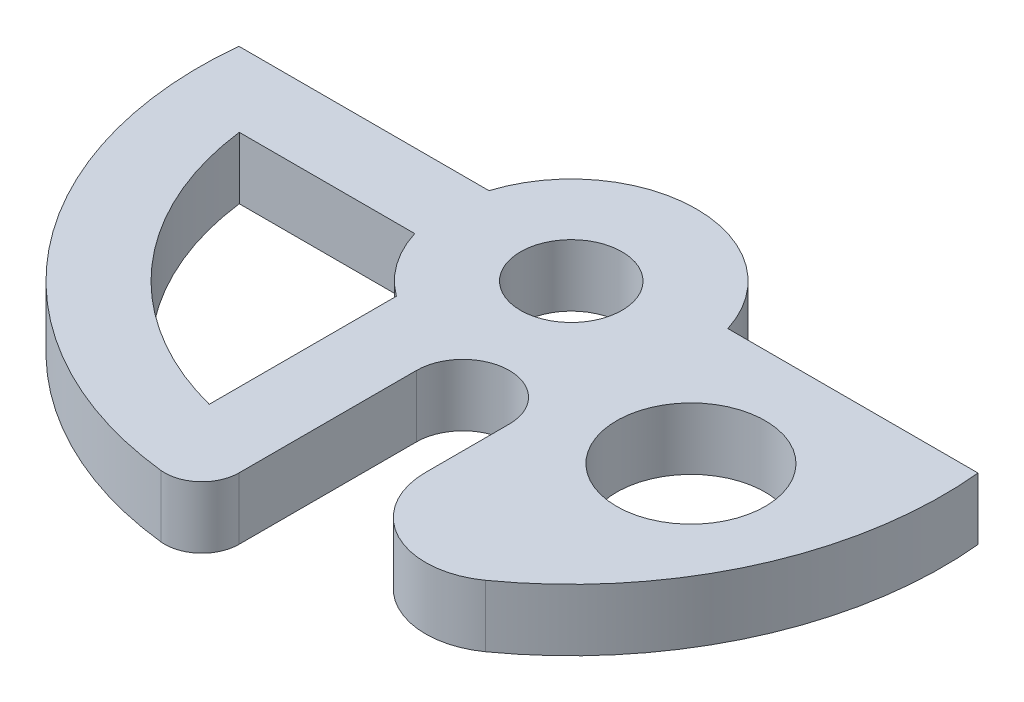
ISO-10303-21;
HEADER;
FILE_DESCRIPTION(('STEP AP214'),'2;1');
FILE_NAME('part.step','',(''),(''),'','','');
FILE_SCHEMA(('AUTOMOTIVE_DESIGN { 1 0 10303 214 1 1 1 1 }'));
ENDSEC;
DATA;
#1=APPLICATION_CONTEXT('core data for automotive mechanical design processes');
#2=APPLICATION_PROTOCOL_DEFINITION('international standard','automotive_design',2000,#1);
#3=PRODUCT_CONTEXT('',#1,'mechanical');
#4=PRODUCT('Part','Part','',(#3));
#5=PRODUCT_RELATED_PRODUCT_CATEGORY('part','',(#4));
#6=PRODUCT_DEFINITION_FORMATION('','',#4);
#7=PRODUCT_DEFINITION_CONTEXT('part definition',#1,'design');
#8=PRODUCT_DEFINITION('design','',#6,#7);
#9=PRODUCT_DEFINITION_SHAPE('','',#8);
#10=(LENGTH_UNIT() NAMED_UNIT(*) SI_UNIT(.MILLI.,.METRE.));
#11=(NAMED_UNIT(*) PLANE_ANGLE_UNIT() SI_UNIT($,.RADIAN.));
#12=(NAMED_UNIT(*) SI_UNIT($,.STERADIAN.) SOLID_ANGLE_UNIT());
#13=UNCERTAINTY_MEASURE_WITH_UNIT(LENGTH_MEASURE(1.E-05),#10,'distance_accuracy_value','');
#14=(GEOMETRIC_REPRESENTATION_CONTEXT(3) GLOBAL_UNCERTAINTY_ASSIGNED_CONTEXT((#13)) GLOBAL_UNIT_ASSIGNED_CONTEXT((#10,
#11,#12)) REPRESENTATION_CONTEXT('',''));
#15=CARTESIAN_POINT('',(0.,0.,0.));
#16=DIRECTION('',(0.,0.,1.));
#17=DIRECTION('',(1.,0.,0.));
#18=AXIS2_PLACEMENT_3D('',#15,#16,#17);
#19=CARTESIAN_POINT('',(0.,5.,0.));
#20=DIRECTION('',(0.,1.,0.));
#21=DIRECTION('',(0.,0.,1.));
#22=AXIS2_PLACEMENT_3D('',#19,#20,#21);
#23=PLANE('',#22);
#24=CARTESIAN_POINT('',(17.5966726849026,5.,7.92934309127702));
#25=DIRECTION('',(0.,1.,0.));
#26=DIRECTION('',(0.,0.,1.));
#27=AXIS2_PLACEMENT_3D('',#24,#25,#26);
#28=CIRCLE('',#27,6.);
#29=CARTESIAN_POINT('',(17.5966726849026,5.,13.929343091277));
#30=VERTEX_POINT('',#29);
#31=EDGE_CURVE('E158',#30,#30,#28,.T.);
#32=ORIENTED_EDGE('',*,*,#31,.F.);
#33=EDGE_LOOP('',(#32));
#34=FACE_BOUND('',#33,.T.);
#35=CARTESIAN_POINT('',(0.,5.,0.));
#36=DIRECTION('',(0.,1.,0.));
#37=DIRECTION('',(0.,0.,1.));
#38=AXIS2_PLACEMENT_3D('',#35,#36,#37);
#39=CIRCLE('',#38,4.1);
#40=CARTESIAN_POINT('',(0.,5.,4.1));
#41=VERTEX_POINT('',#40);
#42=EDGE_CURVE('E199',#41,#41,#39,.T.);
#43=ORIENTED_EDGE('',*,*,#42,.F.);
#44=EDGE_LOOP('',(#43));
#45=FACE_BOUND('',#44,.T.);
#46=CARTESIAN_POINT('',(0.,5.,0.));
#47=DIRECTION('',(0.,1.,0.));
#48=DIRECTION('',(0.,0.,1.));
#49=AXIS2_PLACEMENT_3D('',#46,#47,#48);
#50=CIRCLE('',#49,10.1);
#51=CARTESIAN_POINT('',(9.64416922290355,5.,-3.));
#52=VERTEX_POINT('',#51);
#53=CARTESIAN_POINT('',(-9.64416922290355,5.,-3.));
#54=VERTEX_POINT('',#53);
#55=EDGE_CURVE('E186',#52,#54,#50,.T.);
#56=ORIENTED_EDGE('',*,*,#55,.T.);
#57=DIRECTION('',(-1.,0.,0.));
#58=VECTOR('',#57,1.);
#59=CARTESIAN_POINT('',(0.,5.,-3.));
#60=LINE('',#59,#58);
#61=CARTESIAN_POINT('',(-29.8496231131986,5.,-3.));
#62=VERTEX_POINT('',#61);
#63=EDGE_CURVE('E171',#54,#62,#60,.T.);
#64=ORIENTED_EDGE('',*,*,#63,.T.);
#65=CARTESIAN_POINT('',(0.,5.,0.));
#66=DIRECTION('',(0.,1.,0.));
#67=DIRECTION('',(0.,0.,1.));
#68=AXIS2_PLACEMENT_3D('',#65,#66,#67);
#69=CIRCLE('',#68,30.);
#70=CARTESIAN_POINT('',(-3.33333333333333,5.,29.8142396999972));
#71=VERTEX_POINT('',#70);
#72=EDGE_CURVE('E212',#62,#71,#69,.T.);
#73=ORIENTED_EDGE('',*,*,#72,.T.);
#74=CARTESIAN_POINT('',(-3.,5.,26.8328157299975));
#75=DIRECTION('',(0.,1.,0.));
#76=DIRECTION('',(0.,0.,1.));
#77=AXIS2_PLACEMENT_3D('',#74,#75,#76);
#78=CIRCLE('',#77,3.);
#79=CARTESIAN_POINT('',(0.,5.,26.8328157299975));
#80=VERTEX_POINT('',#79);
#81=EDGE_CURVE('E11',#71,#80,#78,.T.);
#82=ORIENTED_EDGE('',*,*,#81,.T.);
#83=DIRECTION('',(0.,0.,1.));
#84=VECTOR('',#83,1.);
#85=CARTESIAN_POINT('',(0.,5.,0.));
#86=LINE('',#85,#84);
#87=CARTESIAN_POINT('',(0.,5.,12.5));
#88=VERTEX_POINT('',#87);
#89=EDGE_CURVE('E216',#88,#80,#86,.T.);
#90=ORIENTED_EDGE('',*,*,#89,.F.);
#91=CARTESIAN_POINT('',(3.75,5.,12.5));
#92=DIRECTION('',(0.,1.,0.));
#93=DIRECTION('',(0.,0.,1.));
#94=AXIS2_PLACEMENT_3D('',#91,#92,#93);
#95=CIRCLE('',#94,3.75);
#96=CARTESIAN_POINT('',(7.5,5.,12.5));
#97=VERTEX_POINT('',#96);
#98=EDGE_CURVE('E202',#97,#88,#95,.T.);
#99=ORIENTED_EDGE('',*,*,#98,.F.);
#100=DIRECTION('',(0.,0.,1.));
#101=VECTOR('',#100,1.);
#102=CARTESIAN_POINT('',(7.5,5.,0.));
#103=LINE('',#102,#101);
#104=CARTESIAN_POINT('',(7.5,5.,19.2678488679977));
#105=VERTEX_POINT('',#104);
#106=EDGE_CURVE('E206',#97,#105,#103,.T.);
#107=ORIENTED_EDGE('',*,*,#106,.T.);
#108=CARTESIAN_POINT('',(13.8,5.,19.2678488679977));
#109=DIRECTION('',(0.,1.,0.));
#110=DIRECTION('',(0.,0.,1.));
#111=AXIS2_PLACEMENT_3D('',#108,#109,#110);
#112=CIRCLE('',#111,6.3);
#113=CARTESIAN_POINT('',(17.4683544303797,5.,24.3896821113895));
#114=VERTEX_POINT('',#113);
#115=EDGE_CURVE('E209',#105,#114,#112,.T.);
#116=ORIENTED_EDGE('',*,*,#115,.T.);
#117=CARTESIAN_POINT('',(29.8496231131986,5.,-3.));
#118=VERTEX_POINT('',#117);
#119=EDGE_CURVE('E213',#114,#118,#69,.T.);
#120=ORIENTED_EDGE('',*,*,#119,.T.);
#121=DIRECTION('',(1.,0.,0.));
#122=VECTOR('',#121,1.);
#123=CARTESIAN_POINT('',(0.,5.,-3.));
#124=LINE('',#123,#122);
#125=EDGE_CURVE('E178',#52,#118,#124,.T.);
#126=ORIENTED_EDGE('',*,*,#125,.F.);
#127=EDGE_LOOP('',(#56,#64,#73,#82,#90,#99,#107,#116,#120,#126));
#128=FACE_BOUND('',#127,.T.);
#129=DIRECTION('',(1.,0.,0.));
#130=VECTOR('',#129,1.);
#131=CARTESIAN_POINT('',(0.,5.,3.));
#132=LINE('',#131,#130);
#133=CARTESIAN_POINT('',(-23.8117617995813,5.,3.));
#134=VERTEX_POINT('',#133);
#135=CARTESIAN_POINT('',(-9.64416922290355,5.,3.));
#136=VERTEX_POINT('',#135);
#137=EDGE_CURVE('E164',#134,#136,#132,.T.);
#138=ORIENTED_EDGE('',*,*,#137,.T.);
#139=CARTESIAN_POINT('',(0.,5.,0.));
#140=DIRECTION('',(0.,1.,0.));
#141=DIRECTION('',(0.,0.,1.));
#142=AXIS2_PLACEMENT_3D('',#139,#140,#141);
#143=CIRCLE('',#142,10.1);
#144=CARTESIAN_POINT('',(-6.,5.,8.12465383877984));
#145=VERTEX_POINT('',#144);
#146=EDGE_CURVE('E50',#136,#145,#143,.T.);
#147=ORIENTED_EDGE('',*,*,#146,.T.);
#148=DIRECTION('',(0.,0.,-1.));
#149=VECTOR('',#148,1.);
#150=CARTESIAN_POINT('',(-6.,5.,0.));
#151=LINE('',#150,#149);
#152=CARTESIAN_POINT('',(-6.,5.,23.2379000772445));
#153=VERTEX_POINT('',#152);
#154=EDGE_CURVE('E152',#153,#145,#151,.T.);
#155=ORIENTED_EDGE('',*,*,#154,.F.);
#156=CARTESIAN_POINT('',(0.,5.,0.));
#157=DIRECTION('',(0.,1.,0.));
#158=DIRECTION('',(0.,0.,1.));
#159=AXIS2_PLACEMENT_3D('',#156,#157,#158);
#160=CIRCLE('',#159,24.);
#161=EDGE_CURVE('E155',#134,#153,#160,.T.);
#162=ORIENTED_EDGE('',*,*,#161,.F.);
#163=EDGE_LOOP('',(#138,#147,#155,#162));
#164=FACE_BOUND('',#163,.T.);
#165=ADVANCED_FACE('F35',(#34,#45,#128,#164),#23,.T.);
#166=CARTESIAN_POINT('',(0.,0.,0.));
#167=DIRECTION('',(0.,1.,0.));
#168=DIRECTION('',(0.,0.,1.));
#169=AXIS2_PLACEMENT_3D('',#166,#167,#168);
#170=PLANE('',#169);
#171=CARTESIAN_POINT('',(17.5966726849026,0.,7.92934309127702));
#172=DIRECTION('',(0.,1.,0.));
#173=DIRECTION('',(0.,0.,1.));
#174=AXIS2_PLACEMENT_3D('',#171,#172,#173);
#175=CIRCLE('',#174,6.);
#176=CARTESIAN_POINT('',(17.5966726849026,0.,13.929343091277));
#177=VERTEX_POINT('',#176);
#178=EDGE_CURVE('E165',#177,#177,#175,.T.);
#179=ORIENTED_EDGE('',*,*,#178,.T.);
#180=EDGE_LOOP('',(#179));
#181=FACE_BOUND('',#180,.T.);
#182=DIRECTION('',(-1.,0.,0.));
#183=VECTOR('',#182,1.);
#184=CARTESIAN_POINT('',(0.,0.,-3.));
#185=LINE('',#184,#183);
#186=CARTESIAN_POINT('',(-9.64416922290355,0.,-3.));
#187=VERTEX_POINT('',#186);
#188=CARTESIAN_POINT('',(-29.8496231131986,0.,-3.));
#189=VERTEX_POINT('',#188);
#190=EDGE_CURVE('E175',#187,#189,#185,.T.);
#191=ORIENTED_EDGE('',*,*,#190,.F.);
#192=CARTESIAN_POINT('',(0.,0.,0.));
#193=DIRECTION('',(0.,1.,0.));
#194=DIRECTION('',(0.,0.,1.));
#195=AXIS2_PLACEMENT_3D('',#192,#193,#194);
#196=CIRCLE('',#195,10.1);
#197=CARTESIAN_POINT('',(9.64416922290355,0.,-3.));
#198=VERTEX_POINT('',#197);
#199=EDGE_CURVE('E177',#198,#187,#196,.T.);
#200=ORIENTED_EDGE('',*,*,#199,.F.);
#201=DIRECTION('',(1.,0.,0.));
#202=VECTOR('',#201,1.);
#203=CARTESIAN_POINT('',(0.,0.,-3.));
#204=LINE('',#203,#202);
#205=CARTESIAN_POINT('',(29.8496231131986,0.,-3.));
#206=VERTEX_POINT('',#205);
#207=EDGE_CURVE('E180',#198,#206,#204,.T.);
#208=ORIENTED_EDGE('',*,*,#207,.T.);
#209=CARTESIAN_POINT('',(0.,0.,0.));
#210=DIRECTION('',(0.,1.,0.));
#211=DIRECTION('',(0.,0.,1.));
#212=AXIS2_PLACEMENT_3D('',#209,#210,#211);
#213=CIRCLE('',#212,30.);
#214=CARTESIAN_POINT('',(17.4683544303797,0.,24.3896821113895));
#215=VERTEX_POINT('',#214);
#216=EDGE_CURVE('E232',#215,#206,#213,.T.);
#217=ORIENTED_EDGE('',*,*,#216,.F.);
#218=CARTESIAN_POINT('',(13.8,0.,19.2678488679977));
#219=DIRECTION('',(0.,1.,0.));
#220=DIRECTION('',(0.,0.,1.));
#221=AXIS2_PLACEMENT_3D('',#218,#219,#220);
#222=CIRCLE('',#221,6.3);
#223=CARTESIAN_POINT('',(7.5,0.,19.2678488679977));
#224=VERTEX_POINT('',#223);
#225=EDGE_CURVE('E228',#224,#215,#222,.T.);
#226=ORIENTED_EDGE('',*,*,#225,.F.);
#227=DIRECTION('',(0.,0.,1.));
#228=VECTOR('',#227,1.);
#229=CARTESIAN_POINT('',(7.5,0.,0.));
#230=LINE('',#229,#228);
#231=CARTESIAN_POINT('',(7.5,0.,12.5));
#232=VERTEX_POINT('',#231);
#233=EDGE_CURVE('E225',#232,#224,#230,.T.);
#234=ORIENTED_EDGE('',*,*,#233,.F.);
#235=CARTESIAN_POINT('',(3.75,0.,12.5));
#236=DIRECTION('',(0.,1.,0.));
#237=DIRECTION('',(0.,0.,1.));
#238=AXIS2_PLACEMENT_3D('',#235,#236,#237);
#239=CIRCLE('',#238,3.75);
#240=CARTESIAN_POINT('',(0.,0.,12.5));
#241=VERTEX_POINT('',#240);
#242=EDGE_CURVE('E222',#232,#241,#239,.T.);
#243=ORIENTED_EDGE('',*,*,#242,.T.);
#244=DIRECTION('',(0.,0.,1.));
#245=VECTOR('',#244,1.);
#246=CARTESIAN_POINT('',(0.,0.,0.));
#247=LINE('',#246,#245);
#248=CARTESIAN_POINT('',(0.,0.,26.8328157299975));
#249=VERTEX_POINT('',#248);
#250=EDGE_CURVE('E203',#241,#249,#247,.T.);
#251=ORIENTED_EDGE('',*,*,#250,.T.);
#252=CARTESIAN_POINT('',(-3.,0.,26.8328157299975));
#253=DIRECTION('',(0.,1.,0.));
#254=DIRECTION('',(0.,0.,1.));
#255=AXIS2_PLACEMENT_3D('',#252,#253,#254);
#256=CIRCLE('',#255,3.);
#257=CARTESIAN_POINT('',(-3.33333333333333,0.,29.8142396999972));
#258=VERTEX_POINT('',#257);
#259=EDGE_CURVE('E249',#249,#258,#256,.F.);
#260=ORIENTED_EDGE('',*,*,#259,.T.);
#261=EDGE_CURVE('E231',#189,#258,#213,.T.);
#262=ORIENTED_EDGE('',*,*,#261,.F.);
#263=EDGE_LOOP('',(#191,#200,#208,#217,#226,#234,#243,#251,#260,#262));
#264=FACE_BOUND('',#263,.T.);
#265=CARTESIAN_POINT('',(0.,0.,0.));
#266=DIRECTION('',(0.,1.,0.));
#267=DIRECTION('',(0.,0.,1.));
#268=AXIS2_PLACEMENT_3D('',#265,#266,#267);
#269=CIRCLE('',#268,4.1);
#270=CARTESIAN_POINT('',(0.,0.,4.1));
#271=VERTEX_POINT('',#270);
#272=EDGE_CURVE('E192',#271,#271,#269,.T.);
#273=ORIENTED_EDGE('',*,*,#272,.T.);
#274=EDGE_LOOP('',(#273));
#275=FACE_BOUND('',#274,.T.);
#276=CARTESIAN_POINT('',(0.,0.,0.));
#277=DIRECTION('',(0.,1.,0.));
#278=DIRECTION('',(0.,0.,1.));
#279=AXIS2_PLACEMENT_3D('',#276,#277,#278);
#280=CIRCLE('',#279,10.1);
#281=CARTESIAN_POINT('',(-9.64416922290355,0.,3.));
#282=VERTEX_POINT('',#281);
#283=CARTESIAN_POINT('',(-6.,0.,8.12465383877984));
#284=VERTEX_POINT('',#283);
#285=EDGE_CURVE('E143',#282,#284,#280,.T.);
#286=ORIENTED_EDGE('',*,*,#285,.F.);
#287=DIRECTION('',(1.,0.,0.));
#288=VECTOR('',#287,1.);
#289=CARTESIAN_POINT('',(0.,0.,3.));
#290=LINE('',#289,#288);
#291=CARTESIAN_POINT('',(-23.8117617995813,0.,3.));
#292=VERTEX_POINT('',#291);
#293=EDGE_CURVE('E135',#292,#282,#290,.T.);
#294=ORIENTED_EDGE('',*,*,#293,.F.);
#295=CARTESIAN_POINT('',(0.,0.,0.));
#296=DIRECTION('',(0.,1.,0.));
#297=DIRECTION('',(0.,0.,1.));
#298=AXIS2_PLACEMENT_3D('',#295,#296,#297);
#299=CIRCLE('',#298,24.);
#300=CARTESIAN_POINT('',(-6.,0.,23.2379000772445));
#301=VERTEX_POINT('',#300);
#302=EDGE_CURVE('E58',#292,#301,#299,.T.);
#303=ORIENTED_EDGE('',*,*,#302,.T.);
#304=DIRECTION('',(0.,0.,-1.));
#305=VECTOR('',#304,1.);
#306=CARTESIAN_POINT('',(-6.,0.,0.));
#307=LINE('',#306,#305);
#308=EDGE_CURVE('E147',#301,#284,#307,.T.);
#309=ORIENTED_EDGE('',*,*,#308,.T.);
#310=EDGE_LOOP('',(#286,#294,#303,#309));
#311=FACE_BOUND('',#310,.T.);
#312=ADVANCED_FACE('F150',(#181,#264,#275,#311),#170,.F.);
#313=CARTESIAN_POINT('',(0.,5.,0.));
#314=DIRECTION('',(0.,-1.,0.));
#315=DIRECTION('',(0.,0.,-1.));
#316=AXIS2_PLACEMENT_3D('',#313,#314,#315);
#317=CYLINDRICAL_SURFACE('',#316,30.);
#318=DIRECTION('',(0.,1.,0.));
#319=VECTOR('',#318,1.);
#320=CARTESIAN_POINT('',(-29.8496231131986,0.,-3.));
#321=LINE('',#320,#319);
#322=EDGE_CURVE('E190',#189,#62,#321,.T.);
#323=ORIENTED_EDGE('',*,*,#322,.F.);
#324=ORIENTED_EDGE('',*,*,#261,.T.);
#325=DIRECTION('',(0.,-1.,0.));
#326=VECTOR('',#325,1.);
#327=CARTESIAN_POINT('',(-3.33333333333333,5.,29.8142396999972));
#328=LINE('',#327,#326);
#329=EDGE_CURVE('E43',#258,#71,#328,.F.);
#330=ORIENTED_EDGE('',*,*,#329,.T.);
#331=ORIENTED_EDGE('',*,*,#72,.F.);
#332=EDGE_LOOP('',(#323,#324,#330,#331));
#333=FACE_BOUND('',#332,.T.);
#334=ADVANCED_FACE('F257',(#333),#317,.T.);
#335=CARTESIAN_POINT('',(3.75,5.,12.5));
#336=DIRECTION('',(0.,-1.,0.));
#337=DIRECTION('',(0.,0.,-1.));
#338=AXIS2_PLACEMENT_3D('',#335,#336,#337);
#339=CYLINDRICAL_SURFACE('',#338,3.75);
#340=ORIENTED_EDGE('',*,*,#242,.F.);
#341=DIRECTION('',(0.,-1.,0.));
#342=VECTOR('',#341,1.);
#343=CARTESIAN_POINT('',(7.5,5.,12.5));
#344=LINE('',#343,#342);
#345=EDGE_CURVE('E244',#97,#232,#344,.T.);
#346=ORIENTED_EDGE('',*,*,#345,.F.);
#347=ORIENTED_EDGE('',*,*,#98,.T.);
#348=DIRECTION('',(0.,-1.,0.));
#349=VECTOR('',#348,1.);
#350=CARTESIAN_POINT('',(0.,5.,12.5));
#351=LINE('',#350,#349);
#352=EDGE_CURVE('E219',#88,#241,#351,.T.);
#353=ORIENTED_EDGE('',*,*,#352,.T.);
#354=EDGE_LOOP('',(#340,#346,#347,#353));
#355=FACE_BOUND('',#354,.T.);
#356=ADVANCED_FACE('F270',(#355),#339,.F.);
#357=CARTESIAN_POINT('',(7.5,5.,0.));
#358=DIRECTION('',(1.,0.,0.));
#359=DIRECTION('',(0.,0.,-1.));
#360=AXIS2_PLACEMENT_3D('',#357,#358,#359);
#361=PLANE('',#360);
#362=ORIENTED_EDGE('',*,*,#233,.T.);
#363=DIRECTION('',(0.,-1.,0.));
#364=VECTOR('',#363,1.);
#365=CARTESIAN_POINT('',(7.5,5.,19.2678488679977));
#366=LINE('',#365,#364);
#367=EDGE_CURVE('E241',#105,#224,#366,.T.);
#368=ORIENTED_EDGE('',*,*,#367,.F.);
#369=ORIENTED_EDGE('',*,*,#106,.F.);
#370=ORIENTED_EDGE('',*,*,#345,.T.);
#371=EDGE_LOOP('',(#362,#368,#369,#370));
#372=FACE_BOUND('',#371,.T.);
#373=ADVANCED_FACE('F275',(#372),#361,.F.);
#374=CARTESIAN_POINT('',(13.8,5.,19.2678488679977));
#375=DIRECTION('',(0.,-1.,0.));
#376=DIRECTION('',(0.,0.,-1.));
#377=AXIS2_PLACEMENT_3D('',#374,#375,#376);
#378=CYLINDRICAL_SURFACE('',#377,6.3);
#379=ORIENTED_EDGE('',*,*,#225,.T.);
#380=DIRECTION('',(0.,-1.,0.));
#381=VECTOR('',#380,1.);
#382=CARTESIAN_POINT('',(17.4683544303797,5.,24.3896821113895));
#383=LINE('',#382,#381);
#384=EDGE_CURVE('E238',#114,#215,#383,.T.);
#385=ORIENTED_EDGE('',*,*,#384,.F.);
#386=ORIENTED_EDGE('',*,*,#115,.F.);
#387=ORIENTED_EDGE('',*,*,#367,.T.);
#388=EDGE_LOOP('',(#379,#385,#386,#387));
#389=FACE_BOUND('',#388,.T.);
#390=ADVANCED_FACE('F278',(#389),#378,.T.);
#391=ORIENTED_EDGE('',*,*,#216,.T.);
#392=DIRECTION('',(0.,1.,0.));
#393=VECTOR('',#392,1.);
#394=CARTESIAN_POINT('',(29.8496231131986,0.,-3.));
#395=LINE('',#394,#393);
#396=EDGE_CURVE('E193',#206,#118,#395,.T.);
#397=ORIENTED_EDGE('',*,*,#396,.T.);
#398=ORIENTED_EDGE('',*,*,#119,.F.);
#399=ORIENTED_EDGE('',*,*,#384,.T.);
#400=EDGE_LOOP('',(#391,#397,#398,#399));
#401=FACE_BOUND('',#400,.T.);
#402=ADVANCED_FACE('F280',(#401),#317,.T.);
#403=CARTESIAN_POINT('',(0.,5.,0.));
#404=DIRECTION('',(0.,-1.,0.));
#405=DIRECTION('',(0.,0.,-1.));
#406=AXIS2_PLACEMENT_3D('',#403,#404,#405);
#407=CYLINDRICAL_SURFACE('',#406,4.1);
#408=ORIENTED_EDGE('',*,*,#42,.T.);
#409=EDGE_LOOP('',(#408));
#410=FACE_BOUND('',#409,.T.);
#411=ORIENTED_EDGE('',*,*,#272,.F.);
#412=EDGE_LOOP('',(#411));
#413=FACE_BOUND('',#412,.T.);
#414=ADVANCED_FACE('F301',(#410,#413),#407,.F.);
#415=CARTESIAN_POINT('',(0.,5.,0.));
#416=DIRECTION('',(1.,0.,0.));
#417=DIRECTION('',(0.,0.,-1.));
#418=AXIS2_PLACEMENT_3D('',#415,#416,#417);
#419=PLANE('',#418);
#420=ORIENTED_EDGE('',*,*,#89,.T.);
#421=DIRECTION('',(0.,1.,0.));
#422=VECTOR('',#421,1.);
#423=CARTESIAN_POINT('',(0.,0.,26.8328157299975));
#424=LINE('',#423,#422);
#425=EDGE_CURVE('E246',#80,#249,#424,.F.);
#426=ORIENTED_EDGE('',*,*,#425,.T.);
#427=ORIENTED_EDGE('',*,*,#250,.F.);
#428=ORIENTED_EDGE('',*,*,#352,.F.);
#429=EDGE_LOOP('',(#420,#426,#427,#428));
#430=FACE_BOUND('',#429,.T.);
#431=ADVANCED_FACE('F266',(#430),#419,.T.);
#432=CARTESIAN_POINT('',(-3.,5.,26.8328157299975));
#433=DIRECTION('',(0.,-1.,0.));
#434=DIRECTION('',(0.,0.,-1.));
#435=AXIS2_PLACEMENT_3D('',#432,#433,#434);
#436=CYLINDRICAL_SURFACE('',#435,3.);
#437=ORIENTED_EDGE('',*,*,#81,.F.);
#438=ORIENTED_EDGE('',*,*,#329,.F.);
#439=ORIENTED_EDGE('',*,*,#259,.F.);
#440=ORIENTED_EDGE('',*,*,#425,.F.);
#441=EDGE_LOOP('',(#437,#438,#439,#440));
#442=FACE_BOUND('',#441,.T.);
#443=ADVANCED_FACE('F37',(#442),#436,.T.);
#444=CARTESIAN_POINT('',(0.,0.,-3.));
#445=DIRECTION('',(0.,0.,-1.));
#446=DIRECTION('',(-1.,0.,0.));
#447=AXIS2_PLACEMENT_3D('',#444,#445,#446);
#448=PLANE('',#447);
#449=ORIENTED_EDGE('',*,*,#63,.F.);
#450=DIRECTION('',(0.,1.,0.));
#451=VECTOR('',#450,1.);
#452=CARTESIAN_POINT('',(-9.64416922290355,0.,-3.));
#453=LINE('',#452,#451);
#454=EDGE_CURVE('E183',#187,#54,#453,.T.);
#455=ORIENTED_EDGE('',*,*,#454,.F.);
#456=ORIENTED_EDGE('',*,*,#190,.T.);
#457=ORIENTED_EDGE('',*,*,#322,.T.);
#458=EDGE_LOOP('',(#449,#455,#456,#457));
#459=FACE_BOUND('',#458,.T.);
#460=ADVANCED_FACE('F293',(#459),#448,.T.);
#461=CARTESIAN_POINT('',(0.,0.,-3.));
#462=DIRECTION('',(0.,0.,1.));
#463=DIRECTION('',(1.,0.,0.));
#464=AXIS2_PLACEMENT_3D('',#461,#462,#463);
#465=PLANE('',#464);
#466=ORIENTED_EDGE('',*,*,#125,.T.);
#467=ORIENTED_EDGE('',*,*,#396,.F.);
#468=ORIENTED_EDGE('',*,*,#207,.F.);
#469=DIRECTION('',(0.,1.,0.));
#470=VECTOR('',#469,1.);
#471=CARTESIAN_POINT('',(9.64416922290355,0.,-3.));
#472=LINE('',#471,#470);
#473=EDGE_CURVE('E196',#198,#52,#472,.T.);
#474=ORIENTED_EDGE('',*,*,#473,.T.);
#475=EDGE_LOOP('',(#466,#467,#468,#474));
#476=FACE_BOUND('',#475,.T.);
#477=ADVANCED_FACE('F284',(#476),#465,.F.);
#478=CARTESIAN_POINT('',(0.,0.,0.));
#479=DIRECTION('',(0.,1.,0.));
#480=DIRECTION('',(0.,0.,1.));
#481=AXIS2_PLACEMENT_3D('',#478,#479,#480);
#482=CYLINDRICAL_SURFACE('',#481,10.1);
#483=ORIENTED_EDGE('',*,*,#55,.F.);
#484=ORIENTED_EDGE('',*,*,#473,.F.);
#485=ORIENTED_EDGE('',*,*,#199,.T.);
#486=ORIENTED_EDGE('',*,*,#454,.T.);
#487=EDGE_LOOP('',(#483,#484,#485,#486));
#488=FACE_BOUND('',#487,.T.);
#489=ADVANCED_FACE('F288',(#488),#482,.T.);
#490=CARTESIAN_POINT('',(0.,0.,0.));
#491=DIRECTION('',(0.,1.,0.));
#492=DIRECTION('',(0.,0.,1.));
#493=AXIS2_PLACEMENT_3D('',#490,#491,#492);
#494=CYLINDRICAL_SURFACE('',#493,10.1);
#495=ORIENTED_EDGE('',*,*,#146,.F.);
#496=DIRECTION('',(0.,1.,0.));
#497=VECTOR('',#496,1.);
#498=CARTESIAN_POINT('',(-9.64416922290355,0.,3.));
#499=LINE('',#498,#497);
#500=EDGE_CURVE('E138',#282,#136,#499,.T.);
#501=ORIENTED_EDGE('',*,*,#500,.F.);
#502=ORIENTED_EDGE('',*,*,#285,.T.);
#503=DIRECTION('',(0.,1.,0.));
#504=VECTOR('',#503,1.);
#505=CARTESIAN_POINT('',(-6.,0.,8.12465383877984));
#506=LINE('',#505,#504);
#507=EDGE_CURVE('E169',#284,#145,#506,.T.);
#508=ORIENTED_EDGE('',*,*,#507,.T.);
#509=EDGE_LOOP('',(#495,#501,#502,#508));
#510=FACE_BOUND('',#509,.T.);
#511=ADVANCED_FACE('F145',(#510),#494,.T.);
#512=CARTESIAN_POINT('',(-6.,0.,0.));
#513=DIRECTION('',(1.,0.,0.));
#514=DIRECTION('',(0.,0.,-1.));
#515=AXIS2_PLACEMENT_3D('',#512,#513,#514);
#516=PLANE('',#515);
#517=ORIENTED_EDGE('',*,*,#154,.T.);
#518=ORIENTED_EDGE('',*,*,#507,.F.);
#519=ORIENTED_EDGE('',*,*,#308,.F.);
#520=DIRECTION('',(0.,1.,0.));
#521=VECTOR('',#520,1.);
#522=CARTESIAN_POINT('',(-6.,0.,23.2379000772445));
#523=LINE('',#522,#521);
#524=EDGE_CURVE('E172',#301,#153,#523,.T.);
#525=ORIENTED_EDGE('',*,*,#524,.T.);
#526=EDGE_LOOP('',(#517,#518,#519,#525));
#527=FACE_BOUND('',#526,.T.);
#528=ADVANCED_FACE('F365',(#527),#516,.F.);
#529=CARTESIAN_POINT('',(0.,0.,0.));
#530=DIRECTION('',(0.,1.,0.));
#531=DIRECTION('',(0.,0.,1.));
#532=AXIS2_PLACEMENT_3D('',#529,#530,#531);
#533=CYLINDRICAL_SURFACE('',#532,24.);
#534=ORIENTED_EDGE('',*,*,#161,.T.);
#535=ORIENTED_EDGE('',*,*,#524,.F.);
#536=ORIENTED_EDGE('',*,*,#302,.F.);
#537=DIRECTION('',(0.,1.,0.));
#538=VECTOR('',#537,1.);
#539=CARTESIAN_POINT('',(-23.8117617995813,0.,3.));
#540=LINE('',#539,#538);
#541=EDGE_CURVE('E140',#292,#134,#540,.T.);
#542=ORIENTED_EDGE('',*,*,#541,.T.);
#543=EDGE_LOOP('',(#534,#535,#536,#542));
#544=FACE_BOUND('',#543,.T.);
#545=ADVANCED_FACE('F359',(#544),#533,.F.);
#546=CARTESIAN_POINT('',(0.,0.,3.));
#547=DIRECTION('',(0.,0.,1.));
#548=DIRECTION('',(1.,0.,0.));
#549=AXIS2_PLACEMENT_3D('',#546,#547,#548);
#550=PLANE('',#549);
#551=ORIENTED_EDGE('',*,*,#137,.F.);
#552=ORIENTED_EDGE('',*,*,#541,.F.);
#553=ORIENTED_EDGE('',*,*,#293,.T.);
#554=ORIENTED_EDGE('',*,*,#500,.T.);
#555=EDGE_LOOP('',(#551,#552,#553,#554));
#556=FACE_BOUND('',#555,.T.);
#557=ADVANCED_FACE('F137',(#556),#550,.T.);
#558=CARTESIAN_POINT('',(17.5966726849026,0.,7.92934309127702));
#559=DIRECTION('',(0.,1.,0.));
#560=DIRECTION('',(0.,0.,1.));
#561=AXIS2_PLACEMENT_3D('',#558,#559,#560);
#562=CYLINDRICAL_SURFACE('',#561,6.);
#563=ORIENTED_EDGE('',*,*,#178,.F.);
#564=EDGE_LOOP('',(#563));
#565=FACE_BOUND('',#564,.T.);
#566=ORIENTED_EDGE('',*,*,#31,.T.);
#567=EDGE_LOOP('',(#566));
#568=FACE_BOUND('',#567,.T.);
#569=ADVANCED_FACE('F346',(#565,#568),#562,.F.);
#570=CLOSED_SHELL('',(#165,#312,#334,#356,#373,#390,#402,#414,#431,#443,#460,#477,#489,#511,
#528,#545,#557,#569));
#571=MANIFOLD_SOLID_BREP('B2',#570);
#572=ADVANCED_BREP_SHAPE_REPRESENTATION('',(#18,#571),#14);
#573=SHAPE_DEFINITION_REPRESENTATION(#9,#572);
ENDSEC;
END-ISO-10303-21;
